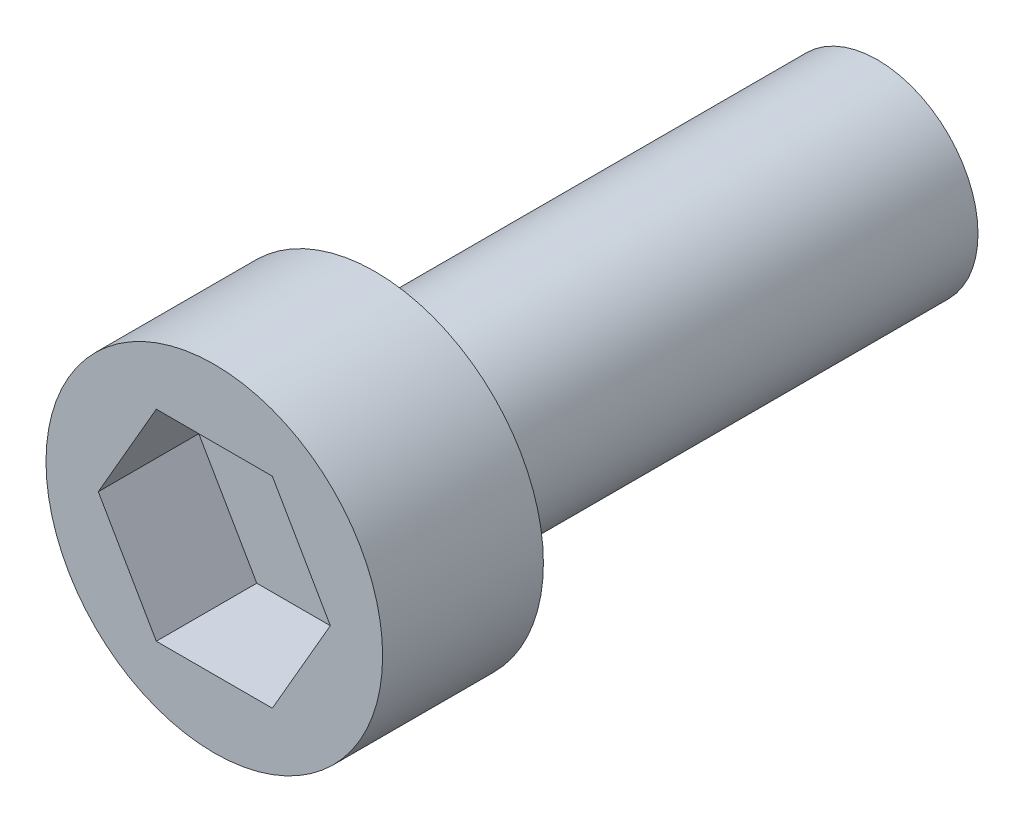
ISO-10303-21;
HEADER;
FILE_DESCRIPTION(('STEP AP214'),'2;1');
FILE_NAME('part.step','',(''),(''),'','','');
FILE_SCHEMA(('AUTOMOTIVE_DESIGN { 1 0 10303 214 1 1 1 1 }'));
ENDSEC;
DATA;
#1=APPLICATION_CONTEXT('core data for automotive mechanical design processes');
#2=APPLICATION_PROTOCOL_DEFINITION('international standard','automotive_design',2000,#1);
#3=PRODUCT_CONTEXT('',#1,'mechanical');
#4=PRODUCT('Part','Part','',(#3));
#5=PRODUCT_RELATED_PRODUCT_CATEGORY('part','',(#4));
#6=PRODUCT_DEFINITION_FORMATION('','',#4);
#7=PRODUCT_DEFINITION_CONTEXT('part definition',#1,'design');
#8=PRODUCT_DEFINITION('design','',#6,#7);
#9=PRODUCT_DEFINITION_SHAPE('','',#8);
#10=(LENGTH_UNIT() NAMED_UNIT(*) SI_UNIT(.MILLI.,.METRE.));
#11=(NAMED_UNIT(*) PLANE_ANGLE_UNIT() SI_UNIT($,.RADIAN.));
#12=(NAMED_UNIT(*) SI_UNIT($,.STERADIAN.) SOLID_ANGLE_UNIT());
#13=UNCERTAINTY_MEASURE_WITH_UNIT(LENGTH_MEASURE(1.E-05),#10,'distance_accuracy_value','');
#14=(GEOMETRIC_REPRESENTATION_CONTEXT(3) GLOBAL_UNCERTAINTY_ASSIGNED_CONTEXT((#13)) GLOBAL_UNIT_ASSIGNED_CONTEXT((#10,
#11,#12)) REPRESENTATION_CONTEXT('',''));
#15=CARTESIAN_POINT('',(0.,0.,0.));
#16=DIRECTION('',(0.,0.,1.));
#17=DIRECTION('',(1.,0.,0.));
#18=AXIS2_PLACEMENT_3D('',#15,#16,#17);
#19=CARTESIAN_POINT('',(0.,0.,5.));
#20=DIRECTION('',(0.,0.,-1.));
#21=DIRECTION('',(-1.,0.,0.));
#22=AXIS2_PLACEMENT_3D('',#19,#20,#21);
#23=CYLINDRICAL_SURFACE('',#22,1.);
#24=CARTESIAN_POINT('',(0.,0.,5.));
#25=DIRECTION('',(0.,0.,1.));
#26=DIRECTION('',(1.,0.,0.));
#27=AXIS2_PLACEMENT_3D('',#24,#25,#26);
#28=CIRCLE('',#27,1.);
#29=CARTESIAN_POINT('',(1.,0.,5.));
#30=VERTEX_POINT('',#29);
#31=EDGE_CURVE('E11',#30,#30,#28,.T.);
#32=ORIENTED_EDGE('',*,*,#31,.F.);
#33=EDGE_LOOP('',(#32));
#34=FACE_BOUND('',#33,.T.);
#35=CARTESIAN_POINT('',(0.,0.,0.));
#36=DIRECTION('',(0.,0.,1.));
#37=DIRECTION('',(1.,0.,0.));
#38=AXIS2_PLACEMENT_3D('',#35,#36,#37);
#39=CIRCLE('',#38,1.);
#40=CARTESIAN_POINT('',(1.,0.,0.));
#41=VERTEX_POINT('',#40);
#42=EDGE_CURVE('E42',#41,#41,#39,.T.);
#43=ORIENTED_EDGE('',*,*,#42,.T.);
#44=EDGE_LOOP('',(#43));
#45=FACE_BOUND('',#44,.T.);
#46=ADVANCED_FACE('F39',(#34,#45),#23,.T.);
#47=CARTESIAN_POINT('',(0.,0.,0.));
#48=DIRECTION('',(0.,0.,1.));
#49=DIRECTION('',(1.,0.,0.));
#50=AXIS2_PLACEMENT_3D('',#47,#48,#49);
#51=PLANE('',#50);
#52=ORIENTED_EDGE('',*,*,#42,.F.);
#53=EDGE_LOOP('',(#52));
#54=FACE_BOUND('',#53,.T.);
#55=ADVANCED_FACE('F189',(#54),#51,.F.);
#56=CARTESIAN_POINT('',(0.,0.,6.6));
#57=DIRECTION('',(0.,0.,-1.));
#58=DIRECTION('',(-1.,0.,0.));
#59=AXIS2_PLACEMENT_3D('',#56,#57,#58);
#60=CYLINDRICAL_SURFACE('',#59,1.675);
#61=CARTESIAN_POINT('',(0.,0.,6.6));
#62=DIRECTION('',(0.,0.,1.));
#63=DIRECTION('',(1.,0.,0.));
#64=AXIS2_PLACEMENT_3D('',#61,#62,#63);
#65=CIRCLE('',#64,1.675);
#66=CARTESIAN_POINT('',(1.675,0.,6.6));
#67=VERTEX_POINT('',#66);
#68=EDGE_CURVE('E163',#67,#67,#65,.T.);
#69=ORIENTED_EDGE('',*,*,#68,.F.);
#70=EDGE_LOOP('',(#69));
#71=FACE_BOUND('',#70,.T.);
#72=CARTESIAN_POINT('',(0.,0.,5.));
#73=DIRECTION('',(0.,0.,1.));
#74=DIRECTION('',(1.,0.,0.));
#75=AXIS2_PLACEMENT_3D('',#72,#73,#74);
#76=CIRCLE('',#75,1.675);
#77=CARTESIAN_POINT('',(1.675,0.,5.));
#78=VERTEX_POINT('',#77);
#79=EDGE_CURVE('E153',#78,#78,#76,.T.);
#80=ORIENTED_EDGE('',*,*,#79,.T.);
#81=EDGE_LOOP('',(#80));
#82=FACE_BOUND('',#81,.T.);
#83=ADVANCED_FACE('F171',(#71,#82),#60,.T.);
#84=CARTESIAN_POINT('',(0.,0.,6.6));
#85=DIRECTION('',(0.,0.,1.));
#86=DIRECTION('',(1.,0.,0.));
#87=AXIS2_PLACEMENT_3D('',#84,#85,#86);
#88=PLANE('',#87);
#89=DIRECTION('',(0.5,0.866025403784439,0.));
#90=VECTOR('',#89,1.);
#91=CARTESIAN_POINT('',(0.577350269189626,-1.,6.6));
#92=LINE('',#91,#90);
#93=CARTESIAN_POINT('',(0.577350269189626,-1.,6.6));
#94=VERTEX_POINT('',#93);
#95=CARTESIAN_POINT('',(1.15470053837925,0.,6.6));
#96=VERTEX_POINT('',#95);
#97=EDGE_CURVE('E54',#94,#96,#92,.T.);
#98=ORIENTED_EDGE('',*,*,#97,.F.);
#99=DIRECTION('',(1.,0.,0.));
#100=VECTOR('',#99,1.);
#101=CARTESIAN_POINT('',(-0.577350269189626,-1.,6.6));
#102=LINE('',#101,#100);
#103=CARTESIAN_POINT('',(-0.577350269189626,-1.,6.6));
#104=VERTEX_POINT('',#103);
#105=EDGE_CURVE('E147',#104,#94,#102,.T.);
#106=ORIENTED_EDGE('',*,*,#105,.F.);
#107=DIRECTION('',(0.5,-0.866025403784439,0.));
#108=VECTOR('',#107,1.);
#109=CARTESIAN_POINT('',(-1.15470053837925,0.,6.6));
#110=LINE('',#109,#108);
#111=CARTESIAN_POINT('',(-1.15470053837925,0.,6.6));
#112=VERTEX_POINT('',#111);
#113=EDGE_CURVE('E144',#112,#104,#110,.T.);
#114=ORIENTED_EDGE('',*,*,#113,.F.);
#115=DIRECTION('',(-0.5,-0.866025403784439,0.));
#116=VECTOR('',#115,1.);
#117=CARTESIAN_POINT('',(-0.577350269189626,1.,6.6));
#118=LINE('',#117,#116);
#119=CARTESIAN_POINT('',(-0.577350269189626,1.,6.6));
#120=VERTEX_POINT('',#119);
#121=EDGE_CURVE('E102',#120,#112,#118,.T.);
#122=ORIENTED_EDGE('',*,*,#121,.F.);
#123=DIRECTION('',(-1.,0.,0.));
#124=VECTOR('',#123,1.);
#125=CARTESIAN_POINT('',(0.577350269189626,1.,6.6));
#126=LINE('',#125,#124);
#127=CARTESIAN_POINT('',(0.577350269189626,1.,6.6));
#128=VERTEX_POINT('',#127);
#129=EDGE_CURVE('E138',#128,#120,#126,.T.);
#130=ORIENTED_EDGE('',*,*,#129,.F.);
#131=DIRECTION('',(-0.5,0.866025403784438,0.));
#132=VECTOR('',#131,1.);
#133=CARTESIAN_POINT('',(1.15470053837925,0.,6.6));
#134=LINE('',#133,#132);
#135=EDGE_CURVE('E134',#96,#128,#134,.T.);
#136=ORIENTED_EDGE('',*,*,#135,.F.);
#137=EDGE_LOOP('',(#98,#106,#114,#122,#130,#136));
#138=FACE_BOUND('',#137,.T.);
#139=ORIENTED_EDGE('',*,*,#68,.T.);
#140=EDGE_LOOP('',(#139));
#141=FACE_BOUND('',#140,.T.);
#142=ADVANCED_FACE('F176',(#138,#141),#88,.T.);
#143=CARTESIAN_POINT('',(0.,0.,5.));
#144=DIRECTION('',(0.,0.,1.));
#145=DIRECTION('',(1.,0.,0.));
#146=AXIS2_PLACEMENT_3D('',#143,#144,#145);
#147=PLANE('',#146);
#148=ORIENTED_EDGE('',*,*,#31,.T.);
#149=EDGE_LOOP('',(#148));
#150=FACE_BOUND('',#149,.T.);
#151=ORIENTED_EDGE('',*,*,#79,.F.);
#152=EDGE_LOOP('',(#151));
#153=FACE_BOUND('',#152,.T.);
#154=ADVANCED_FACE('F173',(#150,#153),#147,.F.);
#155=CARTESIAN_POINT('',(0.577350269189626,-1.,5.6));
#156=DIRECTION('',(0.866025403784439,-0.5,0.));
#157=DIRECTION('',(0.5,0.866025403784439,0.));
#158=AXIS2_PLACEMENT_3D('',#155,#156,#157);
#159=PLANE('',#158);
#160=ORIENTED_EDGE('',*,*,#97,.T.);
#161=DIRECTION('',(0.,0.,1.));
#162=VECTOR('',#161,1.);
#163=CARTESIAN_POINT('',(1.15470053837925,0.,5.6));
#164=LINE('',#163,#162);
#165=CARTESIAN_POINT('',(1.15470053837925,0.,5.6));
#166=VERTEX_POINT('',#165);
#167=EDGE_CURVE('E84',#166,#96,#164,.T.);
#168=ORIENTED_EDGE('',*,*,#167,.F.);
#169=DIRECTION('',(0.5,0.866025403784439,0.));
#170=VECTOR('',#169,1.);
#171=CARTESIAN_POINT('',(0.577350269189626,-1.,5.6));
#172=LINE('',#171,#170);
#173=CARTESIAN_POINT('',(0.577350269189626,-1.,5.6));
#174=VERTEX_POINT('',#173);
#175=EDGE_CURVE('E150',#174,#166,#172,.T.);
#176=ORIENTED_EDGE('',*,*,#175,.F.);
#177=DIRECTION('',(0.,0.,1.));
#178=VECTOR('',#177,1.);
#179=CARTESIAN_POINT('',(0.577350269189626,-1.,5.6));
#180=LINE('',#179,#178);
#181=EDGE_CURVE('E62',#174,#94,#180,.T.);
#182=ORIENTED_EDGE('',*,*,#181,.T.);
#183=EDGE_LOOP('',(#160,#168,#176,#182));
#184=FACE_BOUND('',#183,.T.);
#185=ADVANCED_FACE('F175',(#184),#159,.F.);
#186=CARTESIAN_POINT('',(-0.577350269189626,-1.,5.6));
#187=DIRECTION('',(0.,-1.,0.));
#188=DIRECTION('',(0.,0.,-1.));
#189=AXIS2_PLACEMENT_3D('',#186,#187,#188);
#190=PLANE('',#189);
#191=ORIENTED_EDGE('',*,*,#105,.T.);
#192=ORIENTED_EDGE('',*,*,#181,.F.);
#193=DIRECTION('',(1.,0.,0.));
#194=VECTOR('',#193,1.);
#195=CARTESIAN_POINT('',(-0.577350269189626,-1.,5.6));
#196=LINE('',#195,#194);
#197=CARTESIAN_POINT('',(-0.577350269189626,-1.,5.6));
#198=VERTEX_POINT('',#197);
#199=EDGE_CURVE('E116',#198,#174,#196,.T.);
#200=ORIENTED_EDGE('',*,*,#199,.F.);
#201=DIRECTION('',(0.,0.,1.));
#202=VECTOR('',#201,1.);
#203=CARTESIAN_POINT('',(-0.577350269189626,-1.,5.6));
#204=LINE('',#203,#202);
#205=EDGE_CURVE('E107',#198,#104,#204,.T.);
#206=ORIENTED_EDGE('',*,*,#205,.T.);
#207=EDGE_LOOP('',(#191,#192,#200,#206));
#208=FACE_BOUND('',#207,.T.);
#209=ADVANCED_FACE('F183',(#208),#190,.F.);
#210=CARTESIAN_POINT('',(-1.15470053837925,0.,5.6));
#211=DIRECTION('',(-0.866025403784439,-0.5,0.));
#212=DIRECTION('',(0.5,-0.866025403784439,0.));
#213=AXIS2_PLACEMENT_3D('',#210,#211,#212);
#214=PLANE('',#213);
#215=ORIENTED_EDGE('',*,*,#113,.T.);
#216=ORIENTED_EDGE('',*,*,#205,.F.);
#217=DIRECTION('',(0.5,-0.866025403784439,0.));
#218=VECTOR('',#217,1.);
#219=CARTESIAN_POINT('',(-1.15470053837925,0.,5.6));
#220=LINE('',#219,#218);
#221=CARTESIAN_POINT('',(-1.15470053837925,0.,5.6));
#222=VERTEX_POINT('',#221);
#223=EDGE_CURVE('E111',#222,#198,#220,.T.);
#224=ORIENTED_EDGE('',*,*,#223,.F.);
#225=DIRECTION('',(0.,0.,1.));
#226=VECTOR('',#225,1.);
#227=CARTESIAN_POINT('',(-1.15470053837925,0.,5.6));
#228=LINE('',#227,#226);
#229=EDGE_CURVE('E95',#222,#112,#228,.T.);
#230=ORIENTED_EDGE('',*,*,#229,.T.);
#231=EDGE_LOOP('',(#215,#216,#224,#230));
#232=FACE_BOUND('',#231,.T.);
#233=ADVANCED_FACE('F112',(#232),#214,.F.);
#234=CARTESIAN_POINT('',(-0.577350269189626,1.,5.6));
#235=DIRECTION('',(-0.866025403784439,0.5,0.));
#236=DIRECTION('',(-0.5,-0.866025403784439,0.));
#237=AXIS2_PLACEMENT_3D('',#234,#235,#236);
#238=PLANE('',#237);
#239=ORIENTED_EDGE('',*,*,#121,.T.);
#240=ORIENTED_EDGE('',*,*,#229,.F.);
#241=DIRECTION('',(-0.5,-0.866025403784439,0.));
#242=VECTOR('',#241,1.);
#243=CARTESIAN_POINT('',(-0.577350269189626,1.,5.6));
#244=LINE('',#243,#242);
#245=CARTESIAN_POINT('',(-0.577350269189626,1.,5.6));
#246=VERTEX_POINT('',#245);
#247=EDGE_CURVE('E99',#246,#222,#244,.T.);
#248=ORIENTED_EDGE('',*,*,#247,.F.);
#249=DIRECTION('',(0.,0.,1.));
#250=VECTOR('',#249,1.);
#251=CARTESIAN_POINT('',(-0.577350269189626,1.,5.6));
#252=LINE('',#251,#250);
#253=EDGE_CURVE('E108',#246,#120,#252,.T.);
#254=ORIENTED_EDGE('',*,*,#253,.T.);
#255=EDGE_LOOP('',(#239,#240,#248,#254));
#256=FACE_BOUND('',#255,.T.);
#257=ADVANCED_FACE('F97',(#256),#238,.F.);
#258=CARTESIAN_POINT('',(0.577350269189626,1.,5.6));
#259=DIRECTION('',(0.,1.,0.));
#260=DIRECTION('',(0.,0.,1.));
#261=AXIS2_PLACEMENT_3D('',#258,#259,#260);
#262=PLANE('',#261);
#263=ORIENTED_EDGE('',*,*,#129,.T.);
#264=ORIENTED_EDGE('',*,*,#253,.F.);
#265=DIRECTION('',(-1.,0.,0.));
#266=VECTOR('',#265,1.);
#267=CARTESIAN_POINT('',(0.577350269189626,1.,5.6));
#268=LINE('',#267,#266);
#269=CARTESIAN_POINT('',(0.577350269189626,1.,5.6));
#270=VERTEX_POINT('',#269);
#271=EDGE_CURVE('E122',#270,#246,#268,.T.);
#272=ORIENTED_EDGE('',*,*,#271,.F.);
#273=DIRECTION('',(0.,0.,1.));
#274=VECTOR('',#273,1.);
#275=CARTESIAN_POINT('',(0.577350269189626,1.,5.6));
#276=LINE('',#275,#274);
#277=EDGE_CURVE('E158',#270,#128,#276,.T.);
#278=ORIENTED_EDGE('',*,*,#277,.T.);
#279=EDGE_LOOP('',(#263,#264,#272,#278));
#280=FACE_BOUND('',#279,.T.);
#281=ADVANCED_FACE('F245',(#280),#262,.F.);
#282=CARTESIAN_POINT('',(1.15470053837925,0.,5.6));
#283=DIRECTION('',(0.866025403784439,0.5,0.));
#284=DIRECTION('',(-0.5,0.866025403784438,0.));
#285=AXIS2_PLACEMENT_3D('',#282,#283,#284);
#286=PLANE('',#285);
#287=ORIENTED_EDGE('',*,*,#135,.T.);
#288=ORIENTED_EDGE('',*,*,#277,.F.);
#289=DIRECTION('',(-0.5,0.866025403784438,0.));
#290=VECTOR('',#289,1.);
#291=CARTESIAN_POINT('',(1.15470053837925,0.,5.6));
#292=LINE('',#291,#290);
#293=EDGE_CURVE('E126',#166,#270,#292,.T.);
#294=ORIENTED_EDGE('',*,*,#293,.F.);
#295=ORIENTED_EDGE('',*,*,#167,.T.);
#296=EDGE_LOOP('',(#287,#288,#294,#295));
#297=FACE_BOUND('',#296,.T.);
#298=ADVANCED_FACE('F254',(#297),#286,.F.);
#299=CARTESIAN_POINT('',(0.,0.,5.6));
#300=DIRECTION('',(0.,0.,1.));
#301=DIRECTION('',(1.,0.,0.));
#302=AXIS2_PLACEMENT_3D('',#299,#300,#301);
#303=PLANE('',#302);
#304=ORIENTED_EDGE('',*,*,#175,.T.);
#305=ORIENTED_EDGE('',*,*,#293,.T.);
#306=ORIENTED_EDGE('',*,*,#271,.T.);
#307=ORIENTED_EDGE('',*,*,#247,.T.);
#308=ORIENTED_EDGE('',*,*,#223,.T.);
#309=ORIENTED_EDGE('',*,*,#199,.T.);
#310=EDGE_LOOP('',(#304,#305,#306,#307,#308,#309));
#311=FACE_BOUND('',#310,.T.);
#312=ADVANCED_FACE('F119',(#311),#303,.T.);
#313=CLOSED_SHELL('',(#46,#55,#83,#142,#154,#185,#209,#233,#257,#281,#298,#312));
#314=MANIFOLD_SOLID_BREP('B2',#313);
#315=ADVANCED_BREP_SHAPE_REPRESENTATION('',(#18,#314),#14);
#316=SHAPE_DEFINITION_REPRESENTATION(#9,#315);
ENDSEC;
END-ISO-10303-21;
